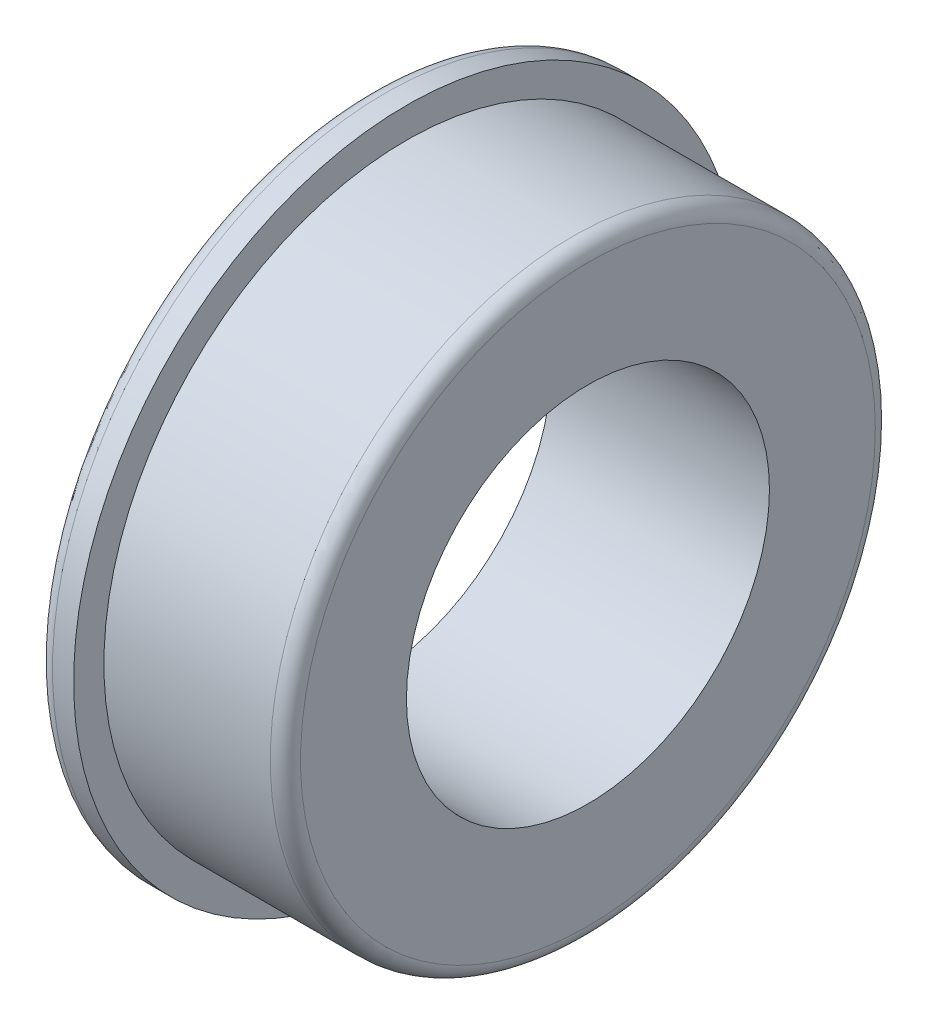
ISO-10303-21;
HEADER;
FILE_DESCRIPTION(('STEP AP214'),'2;1');
FILE_NAME('part.step','',(''),(''),'','','');
FILE_SCHEMA(('AUTOMOTIVE_DESIGN { 1 0 10303 214 1 1 1 1 }'));
ENDSEC;
DATA;
#1=APPLICATION_CONTEXT('core data for automotive mechanical design processes');
#2=APPLICATION_PROTOCOL_DEFINITION('international standard','automotive_design',2000,#1);
#3=PRODUCT_CONTEXT('',#1,'mechanical');
#4=PRODUCT('Part','Part','',(#3));
#5=PRODUCT_RELATED_PRODUCT_CATEGORY('part','',(#4));
#6=PRODUCT_DEFINITION_FORMATION('','',#4);
#7=PRODUCT_DEFINITION_CONTEXT('part definition',#1,'design');
#8=PRODUCT_DEFINITION('design','',#6,#7);
#9=PRODUCT_DEFINITION_SHAPE('','',#8);
#10=(LENGTH_UNIT() NAMED_UNIT(*) SI_UNIT(.MILLI.,.METRE.));
#11=(NAMED_UNIT(*) PLANE_ANGLE_UNIT() SI_UNIT($,.RADIAN.));
#12=(NAMED_UNIT(*) SI_UNIT($,.STERADIAN.) SOLID_ANGLE_UNIT());
#13=UNCERTAINTY_MEASURE_WITH_UNIT(LENGTH_MEASURE(1.E-05),#10,'distance_accuracy_value','');
#14=(GEOMETRIC_REPRESENTATION_CONTEXT(3) GLOBAL_UNCERTAINTY_ASSIGNED_CONTEXT((#13)) GLOBAL_UNIT_ASSIGNED_CONTEXT((#10,
#11,#12)) REPRESENTATION_CONTEXT('',''));
#15=CARTESIAN_POINT('',(0.,0.,0.));
#16=DIRECTION('',(0.,0.,1.));
#17=DIRECTION('',(1.,0.,0.));
#18=AXIS2_PLACEMENT_3D('',#15,#16,#17);
#19=CARTESIAN_POINT('',(0.,0.,0.));
#20=DIRECTION('',(1.,0.,0.));
#21=DIRECTION('',(0.,0.,-1.));
#22=AXIS2_PLACEMENT_3D('',#19,#20,#21);
#23=PLANE('',#22);
#24=CARTESIAN_POINT('',(0.,0.,0.));
#25=DIRECTION('',(1.,0.,0.));
#26=DIRECTION('',(0.,0.,-1.));
#27=AXIS2_PLACEMENT_3D('',#24,#25,#26);
#28=CIRCLE('',#27,3.);
#29=CARTESIAN_POINT('',(0.,0.,-3.));
#30=VERTEX_POINT('',#29);
#31=EDGE_CURVE('E56',#30,#30,#28,.T.);
#32=ORIENTED_EDGE('',*,*,#31,.T.);
#33=EDGE_LOOP('',(#32));
#34=FACE_BOUND('',#33,.T.);
#35=CARTESIAN_POINT('',(0.,0.,0.));
#36=DIRECTION('',(-1.,0.,0.));
#37=DIRECTION('',(0.,0.,1.));
#38=AXIS2_PLACEMENT_3D('',#35,#36,#37);
#39=CIRCLE('',#38,4.375);
#40=CARTESIAN_POINT('',(0.,0.,4.375));
#41=VERTEX_POINT('',#40);
#42=EDGE_CURVE('E71',#41,#41,#39,.T.);
#43=ORIENTED_EDGE('',*,*,#42,.T.);
#44=EDGE_LOOP('',(#43));
#45=FACE_BOUND('',#44,.T.);
#46=ADVANCED_FACE('F32',(#34,#45),#23,.F.);
#47=CARTESIAN_POINT('',(0.6,0.,0.));
#48=DIRECTION('',(-1.,0.,0.));
#49=DIRECTION('',(0.,0.,1.));
#50=AXIS2_PLACEMENT_3D('',#47,#48,#49);
#51=CYLINDRICAL_SURFACE('',#50,5.5);
#52=CARTESIAN_POINT('',(0.25,0.,0.));
#53=DIRECTION('',(1.,0.,0.));
#54=DIRECTION('',(0.,0.,-1.));
#55=AXIS2_PLACEMENT_3D('',#52,#53,#54);
#56=CIRCLE('',#55,5.5);
#57=CARTESIAN_POINT('',(0.25,0.,-5.5));
#58=VERTEX_POINT('',#57);
#59=EDGE_CURVE('E47',#58,#58,#56,.T.);
#60=ORIENTED_EDGE('',*,*,#59,.T.);
#61=EDGE_LOOP('',(#60));
#62=FACE_BOUND('',#61,.T.);
#63=CARTESIAN_POINT('',(0.6,0.,0.));
#64=DIRECTION('',(1.,0.,0.));
#65=DIRECTION('',(0.,0.,-1.));
#66=AXIS2_PLACEMENT_3D('',#63,#64,#65);
#67=CIRCLE('',#66,5.5);
#68=CARTESIAN_POINT('',(0.6,0.,-5.5));
#69=VERTEX_POINT('',#68);
#70=EDGE_CURVE('E53',#69,#69,#67,.T.);
#71=ORIENTED_EDGE('',*,*,#70,.F.);
#72=EDGE_LOOP('',(#71));
#73=FACE_BOUND('',#72,.T.);
#74=ADVANCED_FACE('F105',(#62,#73),#51,.T.);
#75=CARTESIAN_POINT('',(0.6,0.,0.));
#76=DIRECTION('',(1.,0.,0.));
#77=DIRECTION('',(0.,0.,-1.));
#78=AXIS2_PLACEMENT_3D('',#75,#76,#77);
#79=PLANE('',#78);
#80=CARTESIAN_POINT('',(0.6,0.,0.));
#81=DIRECTION('',(1.,0.,0.));
#82=DIRECTION('',(0.,0.,-1.));
#83=AXIS2_PLACEMENT_3D('',#80,#81,#82);
#84=CIRCLE('',#83,5.);
#85=CARTESIAN_POINT('',(0.6,0.,-5.));
#86=VERTEX_POINT('',#85);
#87=EDGE_CURVE('E52',#86,#86,#84,.T.);
#88=ORIENTED_EDGE('',*,*,#87,.F.);
#89=EDGE_LOOP('',(#88));
#90=FACE_BOUND('',#89,.T.);
#91=ORIENTED_EDGE('',*,*,#70,.T.);
#92=EDGE_LOOP('',(#91));
#93=FACE_BOUND('',#92,.T.);
#94=ADVANCED_FACE('F96',(#90,#93),#79,.T.);
#95=CARTESIAN_POINT('',(0.,0.,0.));
#96=DIRECTION('',(1.,0.,0.));
#97=DIRECTION('',(0.,0.,-1.));
#98=AXIS2_PLACEMENT_3D('',#95,#96,#97);
#99=CIRCLE('',#98,5.25);
#100=CARTESIAN_POINT('',(0.,0.,-5.25));
#101=VERTEX_POINT('',#100);
#102=EDGE_CURVE('E43',#101,#101,#99,.F.);
#103=ORIENTED_EDGE('',*,*,#102,.T.);
#104=EDGE_LOOP('',(#103));
#105=FACE_BOUND('',#104,.T.);
#106=CARTESIAN_POINT('',(0.,0.,0.));
#107=DIRECTION('',(-1.,0.,0.));
#108=DIRECTION('',(0.,0.,1.));
#109=AXIS2_PLACEMENT_3D('',#106,#107,#108);
#110=CIRCLE('',#109,4.75);
#111=CARTESIAN_POINT('',(0.,0.,4.75));
#112=VERTEX_POINT('',#111);
#113=EDGE_CURVE('E65',#112,#112,#110,.T.);
#114=ORIENTED_EDGE('',*,*,#113,.F.);
#115=EDGE_LOOP('',(#114));
#116=FACE_BOUND('',#115,.T.);
#117=ADVANCED_FACE('F93',(#105,#116),#23,.F.);
#118=CARTESIAN_POINT('',(3.6,0.,0.));
#119=DIRECTION('',(-1.,0.,0.));
#120=DIRECTION('',(0.,0.,1.));
#121=AXIS2_PLACEMENT_3D('',#118,#119,#120);
#122=CYLINDRICAL_SURFACE('',#121,5.);
#123=CARTESIAN_POINT('',(3.35,0.,0.));
#124=DIRECTION('',(1.,0.,0.));
#125=DIRECTION('',(0.,0.,-1.));
#126=AXIS2_PLACEMENT_3D('',#123,#124,#125);
#127=CIRCLE('',#126,5.);
#128=CARTESIAN_POINT('',(3.35,0.,-5.));
#129=VERTEX_POINT('',#128);
#130=EDGE_CURVE('E10',#129,#129,#127,.F.);
#131=ORIENTED_EDGE('',*,*,#130,.T.);
#132=EDGE_LOOP('',(#131));
#133=FACE_BOUND('',#132,.T.);
#134=ORIENTED_EDGE('',*,*,#87,.T.);
#135=EDGE_LOOP('',(#134));
#136=FACE_BOUND('',#135,.T.);
#137=ADVANCED_FACE('F95',(#133,#136),#122,.T.);
#138=CARTESIAN_POINT('',(3.6,0.,0.));
#139=DIRECTION('',(1.,0.,0.));
#140=DIRECTION('',(0.,0.,-1.));
#141=AXIS2_PLACEMENT_3D('',#138,#139,#140);
#142=PLANE('',#141);
#143=CARTESIAN_POINT('',(3.6,0.,0.));
#144=DIRECTION('',(1.,0.,0.));
#145=DIRECTION('',(0.,0.,-1.));
#146=AXIS2_PLACEMENT_3D('',#143,#144,#145);
#147=CIRCLE('',#146,4.75);
#148=CARTESIAN_POINT('',(3.6,0.,-4.75));
#149=VERTEX_POINT('',#148);
#150=EDGE_CURVE('E39',#149,#149,#147,.T.);
#151=ORIENTED_EDGE('',*,*,#150,.T.);
#152=EDGE_LOOP('',(#151));
#153=FACE_BOUND('',#152,.T.);
#154=CARTESIAN_POINT('',(3.6,0.,0.));
#155=DIRECTION('',(1.,0.,0.));
#156=DIRECTION('',(0.,0.,-1.));
#157=AXIS2_PLACEMENT_3D('',#154,#155,#156);
#158=CIRCLE('',#157,3.);
#159=CARTESIAN_POINT('',(3.6,0.,-3.));
#160=VERTEX_POINT('',#159);
#161=EDGE_CURVE('E59',#160,#160,#158,.T.);
#162=ORIENTED_EDGE('',*,*,#161,.F.);
#163=EDGE_LOOP('',(#162));
#164=FACE_BOUND('',#163,.T.);
#165=ADVANCED_FACE('F103',(#153,#164),#142,.T.);
#166=CARTESIAN_POINT('',(0.,0.,0.));
#167=DIRECTION('',(1.,0.,0.));
#168=DIRECTION('',(0.,0.,-1.));
#169=AXIS2_PLACEMENT_3D('',#166,#167,#168);
#170=CYLINDRICAL_SURFACE('',#169,3.);
#171=ORIENTED_EDGE('',*,*,#31,.F.);
#172=EDGE_LOOP('',(#171));
#173=FACE_BOUND('',#172,.T.);
#174=ORIENTED_EDGE('',*,*,#161,.T.);
#175=EDGE_LOOP('',(#174));
#176=FACE_BOUND('',#175,.T.);
#177=ADVANCED_FACE('F89',(#173,#176),#170,.F.);
#178=CARTESIAN_POINT('',(0.25,0.,0.));
#179=DIRECTION('',(-1.,0.,0.));
#180=DIRECTION('',(0.,0.,1.));
#181=AXIS2_PLACEMENT_3D('',#178,#179,#180);
#182=CYLINDRICAL_SURFACE('',#181,4.75);
#183=CARTESIAN_POINT('',(0.25,0.,0.));
#184=DIRECTION('',(-1.,0.,0.));
#185=DIRECTION('',(0.,0.,1.));
#186=AXIS2_PLACEMENT_3D('',#183,#184,#185);
#187=CIRCLE('',#186,4.75);
#188=CARTESIAN_POINT('',(0.25,0.,4.75));
#189=VERTEX_POINT('',#188);
#190=EDGE_CURVE('E62',#189,#189,#187,.T.);
#191=ORIENTED_EDGE('',*,*,#190,.F.);
#192=EDGE_LOOP('',(#191));
#193=FACE_BOUND('',#192,.T.);
#194=ORIENTED_EDGE('',*,*,#113,.T.);
#195=EDGE_LOOP('',(#194));
#196=FACE_BOUND('',#195,.T.);
#197=ADVANCED_FACE('F83',(#193,#196),#182,.F.);
#198=CARTESIAN_POINT('',(0.25,0.,0.));
#199=DIRECTION('',(-1.,0.,0.));
#200=DIRECTION('',(0.,0.,1.));
#201=AXIS2_PLACEMENT_3D('',#198,#199,#200);
#202=PLANE('',#201);
#203=CARTESIAN_POINT('',(0.25,0.,0.));
#204=DIRECTION('',(-1.,0.,0.));
#205=DIRECTION('',(0.,0.,1.));
#206=AXIS2_PLACEMENT_3D('',#203,#204,#205);
#207=CIRCLE('',#206,4.375);
#208=CARTESIAN_POINT('',(0.25,0.,4.375));
#209=VERTEX_POINT('',#208);
#210=EDGE_CURVE('E68',#209,#209,#207,.T.);
#211=ORIENTED_EDGE('',*,*,#210,.F.);
#212=EDGE_LOOP('',(#211));
#213=FACE_BOUND('',#212,.T.);
#214=ORIENTED_EDGE('',*,*,#190,.T.);
#215=EDGE_LOOP('',(#214));
#216=FACE_BOUND('',#215,.T.);
#217=ADVANCED_FACE('F80',(#213,#216),#202,.T.);
#218=CARTESIAN_POINT('',(0.25,0.,0.));
#219=DIRECTION('',(-1.,0.,0.));
#220=DIRECTION('',(0.,0.,1.));
#221=AXIS2_PLACEMENT_3D('',#218,#219,#220);
#222=CYLINDRICAL_SURFACE('',#221,4.375);
#223=ORIENTED_EDGE('',*,*,#210,.T.);
#224=EDGE_LOOP('',(#223));
#225=FACE_BOUND('',#224,.T.);
#226=ORIENTED_EDGE('',*,*,#42,.F.);
#227=EDGE_LOOP('',(#226));
#228=FACE_BOUND('',#227,.T.);
#229=ADVANCED_FACE('F77',(#225,#228),#222,.T.);
#230=CARTESIAN_POINT('',(0.25,0.,0.));
#231=DIRECTION('',(1.,0.,0.));
#232=DIRECTION('',(0.,0.,-1.));
#233=AXIS2_PLACEMENT_3D('',#230,#231,#232);
#234=TOROIDAL_SURFACE('',#233,5.25,0.25);
#235=ORIENTED_EDGE('',*,*,#102,.F.);
#236=EDGE_LOOP('',(#235));
#237=FACE_BOUND('',#236,.T.);
#238=ORIENTED_EDGE('',*,*,#59,.F.);
#239=EDGE_LOOP('',(#238));
#240=FACE_BOUND('',#239,.T.);
#241=ADVANCED_FACE('F119',(#237,#240),#234,.T.);
#242=CARTESIAN_POINT('',(3.35,0.,0.));
#243=DIRECTION('',(1.,0.,0.));
#244=DIRECTION('',(0.,0.,-1.));
#245=AXIS2_PLACEMENT_3D('',#242,#243,#244);
#246=TOROIDAL_SURFACE('',#245,4.75,0.25);
#247=ORIENTED_EDGE('',*,*,#130,.F.);
#248=EDGE_LOOP('',(#247));
#249=FACE_BOUND('',#248,.T.);
#250=ORIENTED_EDGE('',*,*,#150,.F.);
#251=EDGE_LOOP('',(#250));
#252=FACE_BOUND('',#251,.T.);
#253=ADVANCED_FACE('F34',(#249,#252),#246,.T.);
#254=CLOSED_SHELL('',(#46,#74,#94,#117,#137,#165,#177,#197,#217,#229,#241,#253));
#255=MANIFOLD_SOLID_BREP('B2',#254);
#256=ADVANCED_BREP_SHAPE_REPRESENTATION('',(#18,#255),#14);
#257=SHAPE_DEFINITION_REPRESENTATION(#9,#256);
ENDSEC;
END-ISO-10303-21;
